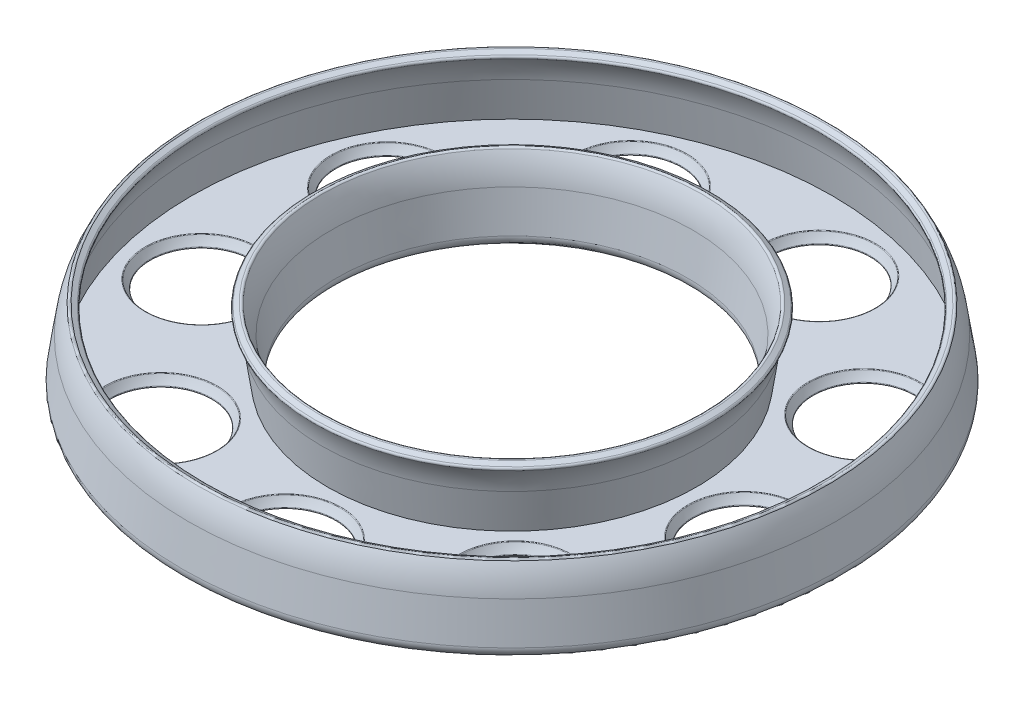
ISO-10303-21;
HEADER;
FILE_DESCRIPTION(('STEP AP214'),'2;1');
FILE_NAME('part.step','',(''),(''),'','','');
FILE_SCHEMA(('AUTOMOTIVE_DESIGN { 1 0 10303 214 1 1 1 1 }'));
ENDSEC;
DATA;
#1=APPLICATION_CONTEXT('core data for automotive mechanical design processes');
#2=APPLICATION_PROTOCOL_DEFINITION('international standard','automotive_design',2000,#1);
#3=PRODUCT_CONTEXT('',#1,'mechanical');
#4=PRODUCT('Part','Part','',(#3));
#5=PRODUCT_RELATED_PRODUCT_CATEGORY('part','',(#4));
#6=PRODUCT_DEFINITION_FORMATION('','',#4);
#7=PRODUCT_DEFINITION_CONTEXT('part definition',#1,'design');
#8=PRODUCT_DEFINITION('design','',#6,#7);
#9=PRODUCT_DEFINITION_SHAPE('','',#8);
#10=(LENGTH_UNIT() NAMED_UNIT(*) SI_UNIT(.MILLI.,.METRE.));
#11=(NAMED_UNIT(*) PLANE_ANGLE_UNIT() SI_UNIT($,.RADIAN.));
#12=(NAMED_UNIT(*) SI_UNIT($,.STERADIAN.) SOLID_ANGLE_UNIT());
#13=UNCERTAINTY_MEASURE_WITH_UNIT(LENGTH_MEASURE(1.E-05),#10,'distance_accuracy_value','');
#14=(GEOMETRIC_REPRESENTATION_CONTEXT(3) GLOBAL_UNCERTAINTY_ASSIGNED_CONTEXT((#13)) GLOBAL_UNIT_ASSIGNED_CONTEXT((#10,
#11,#12)) REPRESENTATION_CONTEXT('',''));
#15=CARTESIAN_POINT('',(0.,0.,0.));
#16=DIRECTION('',(0.,0.,1.));
#17=DIRECTION('',(1.,0.,0.));
#18=AXIS2_PLACEMENT_3D('',#15,#16,#17);
#19=CARTESIAN_POINT('',(0.,0.,0.));
#20=DIRECTION('',(0.,1.,0.));
#21=DIRECTION('',(1.,0.,0.));
#22=AXIS2_PLACEMENT_3D('',#19,#20,#21);
#23=PLANE('',#22);
#24=CARTESIAN_POINT('',(0.,0.,0.));
#25=DIRECTION('',(0.,1.,0.));
#26=DIRECTION('',(0.,0.,1.));
#27=AXIS2_PLACEMENT_3D('',#24,#25,#26);
#28=CIRCLE('',#27,4.40000000001);
#29=CARTESIAN_POINT('',(0.,0.,4.40000000001));
#30=VERTEX_POINT('',#29);
#31=EDGE_CURVE('E321',#30,#30,#28,.T.);
#32=ORIENTED_EDGE('',*,*,#31,.T.);
#33=EDGE_LOOP('',(#32));
#34=FACE_BOUND('',#33,.T.);
#35=CARTESIAN_POINT('',(-2.59448516011472,1.00000982558219E-11,-5.43222300298));
#36=DIRECTION('',(0.,1.,0.));
#37=DIRECTION('',(0.,0.,1.));
#38=AXIS2_PLACEMENT_3D('',#35,#36,#37);
#39=CIRCLE('',#38,1.22856623754056);
#40=CARTESIAN_POINT('',(-2.59448516011472,1.00000982558219E-11,-4.20365676543944));
#41=VERTEX_POINT('',#40);
#42=EDGE_CURVE('E251',#41,#41,#39,.T.);
#43=ORIENTED_EDGE('',*,*,#42,.T.);
#44=EDGE_LOOP('',(#43));
#45=FACE_BOUND('',#44,.T.);
#46=CARTESIAN_POINT('',(1.50427469972045,1.00000982558219E-11,-5.82902715964917));
#47=DIRECTION('',(0.,1.,0.));
#48=DIRECTION('',(0.,0.,1.));
#49=AXIS2_PLACEMENT_3D('',#46,#47,#48);
#50=CIRCLE('',#49,1.22856623754056);
#51=CARTESIAN_POINT('',(1.50427469972045,1.00000982558219E-11,-4.60046092210861));
#52=VERTEX_POINT('',#51);
#53=EDGE_CURVE('E261',#52,#52,#50,.T.);
#54=ORIENTED_EDGE('',*,*,#53,.T.);
#55=EDGE_LOOP('',(#54));
#56=FACE_BOUND('',#55,.T.);
#57=CARTESIAN_POINT('',(4.89916770939004,1.00000982558219E-11,-3.49836472590236));
#58=DIRECTION('',(0.,1.,0.));
#59=DIRECTION('',(0.,0.,1.));
#60=AXIS2_PLACEMENT_3D('',#57,#58,#59);
#61=CIRCLE('',#60,1.22856623754056);
#62=CARTESIAN_POINT('',(4.89916770939004,1.00000982558219E-11,-2.2697984883618));
#63=VERTEX_POINT('',#62);
#64=EDGE_CURVE('E269',#63,#63,#61,.T.);
#65=ORIENTED_EDGE('',*,*,#64,.T.);
#66=EDGE_LOOP('',(#65));
#67=FACE_BOUND('',#66,.T.);
#68=CARTESIAN_POINT('',(-5.4792565790262,1.00000982558219E-11,-2.49362133078733));
#69=DIRECTION('',(0.,1.,0.));
#70=DIRECTION('',(0.,0.,1.));
#71=AXIS2_PLACEMENT_3D('',#68,#69,#70);
#72=CIRCLE('',#71,1.22856623754056);
#73=CARTESIAN_POINT('',(-5.4792565790262,1.00000982558219E-11,-1.26505509324677));
#74=VERTEX_POINT('',#73);
#75=EDGE_CURVE('E280',#74,#74,#72,.T.);
#76=ORIENTED_EDGE('',*,*,#75,.T.);
#77=EDGE_LOOP('',(#76));
#78=FACE_BOUND('',#77,.T.);
#79=CARTESIAN_POINT('',(-5.80022294946221,1.00000982558219E-11,1.61177347561007));
#80=DIRECTION('',(0.,1.,0.));
#81=DIRECTION('',(0.,0.,1.));
#82=AXIS2_PLACEMENT_3D('',#79,#80,#81);
#83=CIRCLE('',#82,1.22856623754056);
#84=CARTESIAN_POINT('',(-5.80022294946221,1.00000982558219E-11,2.84033971315063));
#85=VERTEX_POINT('',#84);
#86=EDGE_CURVE('E285',#85,#85,#83,.T.);
#87=ORIENTED_EDGE('',*,*,#86,.T.);
#88=EDGE_LOOP('',(#87));
#89=FACE_BOUND('',#88,.T.);
#90=CARTESIAN_POINT('',(-3.40720053955189,1.00000982558219E-11,4.96300155988739));
#91=DIRECTION('',(0.,1.,0.));
#92=DIRECTION('',(0.,0.,1.));
#93=AXIS2_PLACEMENT_3D('',#90,#91,#92);
#94=CIRCLE('',#93,1.22856623754056);
#95=CARTESIAN_POINT('',(-3.40720053955189,1.00000982558219E-11,6.19156779742795));
#96=VERTEX_POINT('',#95);
#97=EDGE_CURVE('E284',#96,#96,#94,.T.);
#98=ORIENTED_EDGE('',*,*,#97,.T.);
#99=EDGE_LOOP('',(#98));
#100=FACE_BOUND('',#99,.T.);
#101=CARTESIAN_POINT('',(0.580088869646118,1.00000982558219E-11,5.99198605667972));
#102=DIRECTION('',(0.,1.,0.));
#103=DIRECTION('',(0.,0.,1.));
#104=AXIS2_PLACEMENT_3D('',#101,#102,#103);
#105=CIRCLE('',#104,1.22856623754056);
#106=CARTESIAN_POINT('',(0.580088869646118,1.00000982558219E-11,7.22055229422028));
#107=VERTEX_POINT('',#106);
#108=EDGE_CURVE('E264',#107,#107,#105,.T.);
#109=ORIENTED_EDGE('',*,*,#108,.T.);
#110=EDGE_LOOP('',(#109));
#111=FACE_BOUND('',#110,.T.);
#112=CARTESIAN_POINT('',(4.29594824975172,1.00000982558219E-11,4.21725368404906));
#113=DIRECTION('',(0.,1.,0.));
#114=DIRECTION('',(0.,0.,1.));
#115=AXIS2_PLACEMENT_3D('',#112,#113,#114);
#116=CIRCLE('',#115,1.22856623754056);
#117=CARTESIAN_POINT('',(4.29594824975172,1.00000982558219E-11,5.44581992158962));
#118=VERTEX_POINT('',#117);
#119=EDGE_CURVE('E298',#118,#118,#116,.T.);
#120=ORIENTED_EDGE('',*,*,#119,.T.);
#121=EDGE_LOOP('',(#120));
#122=FACE_BOUND('',#121,.T.);
#123=CARTESIAN_POINT('',(6.00168569965657,1.00000982558219E-11,0.469221443102596));
#124=DIRECTION('',(0.,1.,0.));
#125=DIRECTION('',(0.,0.,1.));
#126=AXIS2_PLACEMENT_3D('',#123,#124,#125);
#127=CIRCLE('',#126,1.22856623754056);
#128=CARTESIAN_POINT('',(6.00168569965657,1.00000982558219E-11,1.69778768064315));
#129=VERTEX_POINT('',#128);
#130=EDGE_CURVE('E306',#129,#129,#127,.T.);
#131=ORIENTED_EDGE('',*,*,#130,.T.);
#132=EDGE_LOOP('',(#131));
#133=FACE_BOUND('',#132,.T.);
#134=CARTESIAN_POINT('',(0.,1.00001996174283E-11,0.));
#135=DIRECTION('',(0.,1.,0.));
#136=DIRECTION('',(0.,0.,1.));
#137=AXIS2_PLACEMENT_3D('',#134,#135,#136);
#138=CIRCLE('',#137,7.64000000001);
#139=CARTESIAN_POINT('',(0.,1.00001996174283E-11,7.64000000001));
#140=VERTEX_POINT('',#139);
#141=EDGE_CURVE('E348',#140,#140,#138,.T.);
#142=ORIENTED_EDGE('',*,*,#141,.F.);
#143=EDGE_LOOP('',(#142));
#144=FACE_BOUND('',#143,.T.);
#145=ADVANCED_FACE('F17',(#34,#45,#56,#67,#78,#89,#100,#111,#122,#133,#144),#23,.F.);
#146=CARTESIAN_POINT('',(0.,0.22,0.));
#147=DIRECTION('',(0.,1.,0.));
#148=DIRECTION('',(1.,0.,0.));
#149=AXIS2_PLACEMENT_3D('',#146,#147,#148);
#150=PLANE('',#149);
#151=CARTESIAN_POINT('',(0.,0.22000000001,0.));
#152=DIRECTION('',(0.,1.,0.));
#153=DIRECTION('',(0.,0.,1.));
#154=AXIS2_PLACEMENT_3D('',#151,#152,#153);
#155=CIRCLE('',#154,4.40000000001);
#156=CARTESIAN_POINT('',(0.,0.22000000001,4.40000000001));
#157=VERTEX_POINT('',#156);
#158=EDGE_CURVE('E358',#157,#157,#155,.T.);
#159=ORIENTED_EDGE('',*,*,#158,.F.);
#160=EDGE_LOOP('',(#159));
#161=FACE_BOUND('',#160,.T.);
#162=CARTESIAN_POINT('',(-2.59448516011472,0.22000000001,-5.43222300298));
#163=DIRECTION('',(0.,-1.,0.));
#164=DIRECTION('',(0.,0.,1.));
#165=AXIS2_PLACEMENT_3D('',#162,#163,#164);
#166=CIRCLE('',#165,1.34133329192517);
#167=CARTESIAN_POINT('',(-2.59448516011472,0.22000000001,-4.09088971105483));
#168=VERTEX_POINT('',#167);
#169=EDGE_CURVE('E336',#168,#168,#166,.T.);
#170=ORIENTED_EDGE('',*,*,#169,.T.);
#171=EDGE_LOOP('',(#170));
#172=FACE_BOUND('',#171,.T.);
#173=CARTESIAN_POINT('',(1.50427469972045,0.22000000001,-5.82902715964917));
#174=DIRECTION('',(0.,-1.,0.));
#175=DIRECTION('',(0.,0.,1.));
#176=AXIS2_PLACEMENT_3D('',#173,#174,#175);
#177=CIRCLE('',#176,1.34133329192517);
#178=CARTESIAN_POINT('',(1.50427469972045,0.22000000001,-4.487693867724));
#179=VERTEX_POINT('',#178);
#180=EDGE_CURVE('E342',#179,#179,#177,.T.);
#181=ORIENTED_EDGE('',*,*,#180,.T.);
#182=EDGE_LOOP('',(#181));
#183=FACE_BOUND('',#182,.T.);
#184=CARTESIAN_POINT('',(4.89916770939004,0.22000000001,-3.49836472590236));
#185=DIRECTION('',(0.,-1.,0.));
#186=DIRECTION('',(0.,0.,1.));
#187=AXIS2_PLACEMENT_3D('',#184,#185,#186);
#188=CIRCLE('',#187,1.34133329192517);
#189=CARTESIAN_POINT('',(4.89916770939004,0.22000000001,-2.15703143397719));
#190=VERTEX_POINT('',#189);
#191=EDGE_CURVE('E351',#190,#190,#188,.T.);
#192=ORIENTED_EDGE('',*,*,#191,.T.);
#193=EDGE_LOOP('',(#192));
#194=FACE_BOUND('',#193,.T.);
#195=CARTESIAN_POINT('',(-5.4792565790262,0.22000000001,-2.49362133078733));
#196=DIRECTION('',(0.,-1.,0.));
#197=DIRECTION('',(0.,0.,1.));
#198=AXIS2_PLACEMENT_3D('',#195,#196,#197);
#199=CIRCLE('',#198,1.34133329192517);
#200=CARTESIAN_POINT('',(-5.4792565790262,0.22000000001,-1.15228803886216));
#201=VERTEX_POINT('',#200);
#202=EDGE_CURVE('E362',#201,#201,#199,.T.);
#203=ORIENTED_EDGE('',*,*,#202,.T.);
#204=EDGE_LOOP('',(#203));
#205=FACE_BOUND('',#204,.T.);
#206=CARTESIAN_POINT('',(-5.80022294946221,0.22000000001,1.61177347561007));
#207=DIRECTION('',(0.,-1.,0.));
#208=DIRECTION('',(0.,0.,1.));
#209=AXIS2_PLACEMENT_3D('',#206,#207,#208);
#210=CIRCLE('',#209,1.34133329192517);
#211=CARTESIAN_POINT('',(-5.80022294946221,0.22000000001,2.95310676753524));
#212=VERTEX_POINT('',#211);
#213=EDGE_CURVE('E295',#212,#212,#210,.T.);
#214=ORIENTED_EDGE('',*,*,#213,.T.);
#215=EDGE_LOOP('',(#214));
#216=FACE_BOUND('',#215,.T.);
#217=CARTESIAN_POINT('',(-3.40720053955189,0.22000000001,4.96300155988739));
#218=DIRECTION('',(0.,-1.,0.));
#219=DIRECTION('',(0.,0.,1.));
#220=AXIS2_PLACEMENT_3D('',#217,#218,#219);
#221=CIRCLE('',#220,1.34133329192517);
#222=CARTESIAN_POINT('',(-3.40720053955189,0.22000000001,6.30433485181256));
#223=VERTEX_POINT('',#222);
#224=EDGE_CURVE('E294',#223,#223,#221,.T.);
#225=ORIENTED_EDGE('',*,*,#224,.T.);
#226=EDGE_LOOP('',(#225));
#227=FACE_BOUND('',#226,.T.);
#228=CARTESIAN_POINT('',(0.580088869646118,0.22000000001,5.99198605667972));
#229=DIRECTION('',(0.,-1.,0.));
#230=DIRECTION('',(0.,0.,1.));
#231=AXIS2_PLACEMENT_3D('',#228,#229,#230);
#232=CIRCLE('',#231,1.34133329192517);
#233=CARTESIAN_POINT('',(0.580088869646118,0.22000000001,7.33331934860489));
#234=VERTEX_POINT('',#233);
#235=EDGE_CURVE('E383',#234,#234,#232,.T.);
#236=ORIENTED_EDGE('',*,*,#235,.T.);
#237=EDGE_LOOP('',(#236));
#238=FACE_BOUND('',#237,.T.);
#239=CARTESIAN_POINT('',(4.29594824975172,0.22000000001,4.21725368404906));
#240=DIRECTION('',(0.,-1.,0.));
#241=DIRECTION('',(0.,0.,1.));
#242=AXIS2_PLACEMENT_3D('',#239,#240,#241);
#243=CIRCLE('',#242,1.34133329192517);
#244=CARTESIAN_POINT('',(4.29594824975172,0.22000000001,5.55858697597423));
#245=VERTEX_POINT('',#244);
#246=EDGE_CURVE('E377',#245,#245,#243,.T.);
#247=ORIENTED_EDGE('',*,*,#246,.T.);
#248=EDGE_LOOP('',(#247));
#249=FACE_BOUND('',#248,.T.);
#250=CARTESIAN_POINT('',(6.00168569965657,0.22000000001,0.469221443102596));
#251=DIRECTION('',(0.,-1.,0.));
#252=DIRECTION('',(0.,0.,1.));
#253=AXIS2_PLACEMENT_3D('',#250,#251,#252);
#254=CIRCLE('',#253,1.34133329192517);
#255=CARTESIAN_POINT('',(6.00168569965657,0.22000000001,1.81055473502777));
#256=VERTEX_POINT('',#255);
#257=EDGE_CURVE('E314',#256,#256,#254,.T.);
#258=ORIENTED_EDGE('',*,*,#257,.T.);
#259=EDGE_LOOP('',(#258));
#260=FACE_BOUND('',#259,.T.);
#261=CARTESIAN_POINT('',(0.,0.22000000001,0.));
#262=DIRECTION('',(0.,1.,0.));
#263=DIRECTION('',(0.,0.,1.));
#264=AXIS2_PLACEMENT_3D('',#261,#262,#263);
#265=CIRCLE('',#264,7.64000000001);
#266=CARTESIAN_POINT('',(0.,0.22000000001,7.64000000001));
#267=VERTEX_POINT('',#266);
#268=EDGE_CURVE('E368',#267,#267,#265,.T.);
#269=ORIENTED_EDGE('',*,*,#268,.T.);
#270=EDGE_LOOP('',(#269));
#271=FACE_BOUND('',#270,.T.);
#272=ADVANCED_FACE('F19',(#161,#172,#183,#194,#205,#216,#227,#238,#249,#260,#271),#150,.T.);
#273=CARTESIAN_POINT('',(0.,1.16827390606098,0.));
#274=DIRECTION('',(0.,-1.,0.));
#275=DIRECTION('',(0.,0.,-1.));
#276=AXIS2_PLACEMENT_3D('',#273,#274,#275);
#277=CONICAL_SURFACE('',#276,7.7212502251311,0.14778968226717);
#278=CARTESIAN_POINT('',(0.,1.16827390607098,0.));
#279=DIRECTION('',(0.,1.,0.));
#280=DIRECTION('',(0.,0.,1.));
#281=AXIS2_PLACEMENT_3D('',#278,#279,#280);
#282=CIRCLE('',#281,7.7212502251411);
#283=CARTESIAN_POINT('',(0.,1.16827390607098,7.7212502251411));
#284=VERTEX_POINT('',#283);
#285=EDGE_CURVE('E11',#284,#284,#282,.T.);
#286=ORIENTED_EDGE('',*,*,#285,.F.);
#287=EDGE_LOOP('',(#286));
#288=FACE_BOUND('',#287,.T.);
#289=CARTESIAN_POINT('',(0.,0.252395499622451,0.));
#290=DIRECTION('',(0.,1.,0.));
#291=DIRECTION('',(0.,0.,1.));
#292=AXIS2_PLACEMENT_3D('',#289,#290,#291);
#293=CIRCLE('',#292,7.85760177299188);
#294=CARTESIAN_POINT('',(0.,0.252395499622451,7.85760177299188));
#295=VERTEX_POINT('',#294);
#296=EDGE_CURVE('E317',#295,#295,#293,.T.);
#297=ORIENTED_EDGE('',*,*,#296,.T.);
#298=EDGE_LOOP('',(#297));
#299=FACE_BOUND('',#298,.T.);
#300=ADVANCED_FACE('F1065',(#288,#299),#277,.T.);
#301=CARTESIAN_POINT('',(0.,0.891058031943213,0.));
#302=DIRECTION('',(0.,1.,0.));
#303=DIRECTION('',(0.,0.,1.));
#304=AXIS2_PLACEMENT_3D('',#301,#302,#303);
#305=TOROIDAL_SURFACE('',#304,5.85918091215886,1.88259150300212);
#306=ORIENTED_EDGE('',*,*,#285,.T.);
#307=EDGE_LOOP('',(#306));
#308=FACE_BOUND('',#307,.T.);
#309=CARTESIAN_POINT('',(0.,1.80425368574958,0.));
#310=DIRECTION('',(0.,1.,0.));
#311=DIRECTION('',(0.,0.,1.));
#312=AXIS2_PLACEMENT_3D('',#309,#310,#311);
#313=CIRCLE('',#312,7.5054568504803);
#314=CARTESIAN_POINT('',(0.,1.80425368574958,7.5054568504803));
#315=VERTEX_POINT('',#314);
#316=EDGE_CURVE('E26',#315,#315,#313,.T.);
#317=ORIENTED_EDGE('',*,*,#316,.F.);
#318=EDGE_LOOP('',(#317));
#319=FACE_BOUND('',#318,.T.);
#320=ADVANCED_FACE('F1057',(#308,#319),#305,.T.);
#321=CARTESIAN_POINT('',(0.,1.78,0.));
#322=DIRECTION('',(0.,1.,0.));
#323=DIRECTION('',(0.,0.,1.));
#324=AXIS2_PLACEMENT_3D('',#321,#322,#323);
#325=TOROIDAL_SURFACE('',#324,7.46173318721977,0.05);
#326=ORIENTED_EDGE('',*,*,#316,.T.);
#327=EDGE_LOOP('',(#326));
#328=FACE_BOUND('',#327,.T.);
#329=CARTESIAN_POINT('',(0.,1.82389005707395,0.));
#330=DIRECTION('',(0.,1.,0.));
#331=DIRECTION('',(0.,0.,1.));
#332=AXIS2_PLACEMENT_3D('',#329,#330,#331);
#333=CIRCLE('',#332,7.4377819264921);
#334=CARTESIAN_POINT('',(0.,1.82389005707395,7.4377819264921));
#335=VERTEX_POINT('',#334);
#336=EDGE_CURVE('E404',#335,#335,#333,.T.);
#337=ORIENTED_EDGE('',*,*,#336,.F.);
#338=EDGE_LOOP('',(#337));
#339=FACE_BOUND('',#338,.T.);
#340=ADVANCED_FACE('F1048',(#328,#339),#325,.T.);
#341=CARTESIAN_POINT('',(0.,1.82389005706395,0.));
#342=DIRECTION('',(0.,1.,0.));
#343=DIRECTION('',(0.,0.,1.));
#344=AXIS2_PLACEMENT_3D('',#341,#342,#343);
#345=CONICAL_SURFACE('',#344,7.4377819264821,1.07125243658243);
#346=CARTESIAN_POINT('',(0.,1.76640636340197,0.));
#347=DIRECTION('',(0.,1.,0.));
#348=DIRECTION('',(0.,0.,1.));
#349=AXIS2_PLACEMENT_3D('',#346,#347,#348);
#350=CIRCLE('',#349,7.33244456562651);
#351=CARTESIAN_POINT('',(0.,1.76640636340197,7.33244456562651));
#352=VERTEX_POINT('',#351);
#353=EDGE_CURVE('E330',#352,#352,#350,.T.);
#354=ORIENTED_EDGE('',*,*,#353,.F.);
#355=EDGE_LOOP('',(#354));
#356=FACE_BOUND('',#355,.T.);
#357=ORIENTED_EDGE('',*,*,#336,.T.);
#358=EDGE_LOOP('',(#357));
#359=FACE_BOUND('',#358,.T.);
#360=ADVANCED_FACE('F731',(#356,#359),#345,.F.);
#361=CARTESIAN_POINT('',(0.,0.891054187571443,0.));
#362=DIRECTION('',(0.,1.,0.));
#363=DIRECTION('',(0.,0.,1.));
#364=AXIS2_PLACEMENT_3D('',#361,#362,#363);
#365=TOROIDAL_SURFACE('',#364,5.85915508937103,1.6626176103874);
#366=CARTESIAN_POINT('',(0.,1.13587840645853,0.));
#367=DIRECTION('',(0.,1.,0.));
#368=DIRECTION('',(0.,0.,1.));
#369=AXIS2_PLACEMENT_3D('',#366,#367,#368);
#370=CIRCLE('',#369,7.50364845215922);
#371=CARTESIAN_POINT('',(0.,1.13587840645853,7.50364845215922));
#372=VERTEX_POINT('',#371);
#373=EDGE_CURVE('E371',#372,#372,#370,.T.);
#374=ORIENTED_EDGE('',*,*,#373,.F.);
#375=EDGE_LOOP('',(#374));
#376=FACE_BOUND('',#375,.T.);
#377=CARTESIAN_POINT('',(0.,1.69824170721813,0.));
#378=DIRECTION('',(0.,1.,0.));
#379=DIRECTION('',(0.,0.,1.));
#380=AXIS2_PLACEMENT_3D('',#377,#378,#379);
#381=CIRCLE('',#380,7.3126837703891);
#382=CARTESIAN_POINT('',(0.,1.69824170721813,7.3126837703891));
#383=VERTEX_POINT('',#382);
#384=EDGE_CURVE('E327',#383,#383,#381,.T.);
#385=ORIENTED_EDGE('',*,*,#384,.T.);
#386=EDGE_LOOP('',(#385));
#387=FACE_BOUND('',#386,.T.);
#388=ADVANCED_FACE('F726',(#376,#387),#365,.F.);
#389=CARTESIAN_POINT('',(0.,0.22,0.));
#390=DIRECTION('',(0.,-1.,0.));
#391=DIRECTION('',(0.,0.,-1.));
#392=AXIS2_PLACEMENT_3D('',#389,#390,#391);
#393=CONICAL_SURFACE('',#392,7.64,0.147789682267168);
#394=ORIENTED_EDGE('',*,*,#373,.T.);
#395=EDGE_LOOP('',(#394));
#396=FACE_BOUND('',#395,.T.);
#397=ORIENTED_EDGE('',*,*,#268,.F.);
#398=EDGE_LOOP('',(#397));
#399=FACE_BOUND('',#398,.T.);
#400=ADVANCED_FACE('F730',(#396,#399),#393,.F.);
#401=CARTESIAN_POINT('',(0.,0.22,0.));
#402=DIRECTION('',(0.,1.,0.));
#403=DIRECTION('',(0.,0.,1.));
#404=AXIS2_PLACEMENT_3D('',#401,#402,#403);
#405=CONICAL_SURFACE('',#404,4.4,0.14778968226717);
#406=ORIENTED_EDGE('',*,*,#158,.T.);
#407=EDGE_LOOP('',(#406));
#408=FACE_BOUND('',#407,.T.);
#409=CARTESIAN_POINT('',(0.,1.13587840645853,0.));
#410=DIRECTION('',(0.,1.,0.));
#411=DIRECTION('',(0.,0.,1.));
#412=AXIS2_PLACEMENT_3D('',#409,#410,#411);
#413=CIRCLE('',#412,4.53635154786079);
#414=CARTESIAN_POINT('',(0.,1.13587840645853,4.53635154786079));
#415=VERTEX_POINT('',#414);
#416=EDGE_CURVE('E355',#415,#415,#413,.T.);
#417=ORIENTED_EDGE('',*,*,#416,.F.);
#418=EDGE_LOOP('',(#417));
#419=FACE_BOUND('',#418,.T.);
#420=ADVANCED_FACE('F947',(#408,#419),#405,.T.);
#421=CARTESIAN_POINT('',(0.,0.891054187571443,0.));
#422=DIRECTION('',(0.,1.,0.));
#423=DIRECTION('',(0.,0.,1.));
#424=AXIS2_PLACEMENT_3D('',#421,#422,#423);
#425=TOROIDAL_SURFACE('',#424,6.18084491062897,1.6626176103874);
#426=CARTESIAN_POINT('',(0.,1.69824170721813,0.));
#427=DIRECTION('',(0.,1.,0.));
#428=DIRECTION('',(0.,0.,1.));
#429=AXIS2_PLACEMENT_3D('',#426,#427,#428);
#430=CIRCLE('',#429,4.7273162296309);
#431=CARTESIAN_POINT('',(0.,1.69824170721813,4.7273162296309));
#432=VERTEX_POINT('',#431);
#433=EDGE_CURVE('E359',#432,#432,#430,.T.);
#434=ORIENTED_EDGE('',*,*,#433,.F.);
#435=EDGE_LOOP('',(#434));
#436=FACE_BOUND('',#435,.T.);
#437=ORIENTED_EDGE('',*,*,#416,.T.);
#438=EDGE_LOOP('',(#437));
#439=FACE_BOUND('',#438,.T.);
#440=ADVANCED_FACE('F943',(#436,#439),#425,.F.);
#441=CARTESIAN_POINT('',(0.,1.72251630632802,0.));
#442=DIRECTION('',(0.,1.,0.));
#443=DIRECTION('',(0.,0.,1.));
#444=AXIS2_PLACEMENT_3D('',#441,#442,#443);
#445=TOROIDAL_SURFACE('',#444,4.68360417364583,0.05);
#446=ORIENTED_EDGE('',*,*,#433,.T.);
#447=EDGE_LOOP('',(#446));
#448=FACE_BOUND('',#447,.T.);
#449=CARTESIAN_POINT('',(0.,1.76640636340197,0.));
#450=DIRECTION('',(0.,1.,0.));
#451=DIRECTION('',(0.,0.,1.));
#452=AXIS2_PLACEMENT_3D('',#449,#450,#451);
#453=CIRCLE('',#452,4.70755543439349);
#454=CARTESIAN_POINT('',(0.,1.76640636340197,4.70755543439349));
#455=VERTEX_POINT('',#454);
#456=EDGE_CURVE('E386',#455,#455,#453,.T.);
#457=ORIENTED_EDGE('',*,*,#456,.F.);
#458=EDGE_LOOP('',(#457));
#459=FACE_BOUND('',#458,.T.);
#460=ADVANCED_FACE('F823',(#448,#459),#445,.T.);
#461=CARTESIAN_POINT('',(0.,1.82389005706395,0.));
#462=DIRECTION('',(0.,-1.,0.));
#463=DIRECTION('',(0.,0.,-1.));
#464=AXIS2_PLACEMENT_3D('',#461,#462,#463);
#465=CONICAL_SURFACE('',#464,4.6022180735179,1.07125243658244);
#466=CARTESIAN_POINT('',(0.,1.82389005707395,0.));
#467=DIRECTION('',(0.,1.,0.));
#468=DIRECTION('',(0.,0.,1.));
#469=AXIS2_PLACEMENT_3D('',#466,#467,#468);
#470=CIRCLE('',#469,4.6022180735279);
#471=CARTESIAN_POINT('',(0.,1.82389005707395,4.6022180735279));
#472=VERTEX_POINT('',#471);
#473=EDGE_CURVE('E401',#472,#472,#470,.T.);
#474=ORIENTED_EDGE('',*,*,#473,.F.);
#475=EDGE_LOOP('',(#474));
#476=FACE_BOUND('',#475,.T.);
#477=ORIENTED_EDGE('',*,*,#456,.T.);
#478=EDGE_LOOP('',(#477));
#479=FACE_BOUND('',#478,.T.);
#480=ADVANCED_FACE('F818',(#476,#479),#465,.T.);
#481=CARTESIAN_POINT('',(0.,1.78,0.));
#482=DIRECTION('',(0.,1.,0.));
#483=DIRECTION('',(0.,0.,1.));
#484=AXIS2_PLACEMENT_3D('',#481,#482,#483);
#485=TOROIDAL_SURFACE('',#484,4.57826681278023,0.05);
#486=ORIENTED_EDGE('',*,*,#473,.T.);
#487=EDGE_LOOP('',(#486));
#488=FACE_BOUND('',#487,.T.);
#489=CARTESIAN_POINT('',(0.,1.80425368574958,0.));
#490=DIRECTION('',(0.,1.,0.));
#491=DIRECTION('',(0.,0.,1.));
#492=AXIS2_PLACEMENT_3D('',#489,#490,#491);
#493=CIRCLE('',#492,4.53454314953971);
#494=CARTESIAN_POINT('',(0.,1.80425368574958,4.53454314953971));
#495=VERTEX_POINT('',#494);
#496=EDGE_CURVE('E398',#495,#495,#493,.T.);
#497=ORIENTED_EDGE('',*,*,#496,.F.);
#498=EDGE_LOOP('',(#497));
#499=FACE_BOUND('',#498,.T.);
#500=ADVANCED_FACE('F822',(#488,#499),#485,.T.);
#501=CARTESIAN_POINT('',(0.,0.891058031943213,0.));
#502=DIRECTION('',(0.,1.,0.));
#503=DIRECTION('',(0.,0.,1.));
#504=AXIS2_PLACEMENT_3D('',#501,#502,#503);
#505=TOROIDAL_SURFACE('',#504,6.18081908784115,1.88259150300212);
#506=ORIENTED_EDGE('',*,*,#496,.T.);
#507=EDGE_LOOP('',(#506));
#508=FACE_BOUND('',#507,.T.);
#509=CARTESIAN_POINT('',(0.,1.16827390607098,0.));
#510=DIRECTION('',(0.,1.,0.));
#511=DIRECTION('',(0.,0.,1.));
#512=AXIS2_PLACEMENT_3D('',#509,#510,#511);
#513=CIRCLE('',#512,4.3187497748789);
#514=CARTESIAN_POINT('',(0.,1.16827390607098,4.3187497748789));
#515=VERTEX_POINT('',#514);
#516=EDGE_CURVE('E395',#515,#515,#513,.T.);
#517=ORIENTED_EDGE('',*,*,#516,.F.);
#518=EDGE_LOOP('',(#517));
#519=FACE_BOUND('',#518,.T.);
#520=ADVANCED_FACE('F691',(#508,#519),#505,.T.);
#521=CARTESIAN_POINT('',(0.,1.16827390606098,0.));
#522=DIRECTION('',(0.,1.,0.));
#523=DIRECTION('',(0.,0.,1.));
#524=AXIS2_PLACEMENT_3D('',#521,#522,#523);
#525=CONICAL_SURFACE('',#524,4.3187497748689,0.14778968226717);
#526=CARTESIAN_POINT('',(0.,0.25239549962245,0.));
#527=DIRECTION('',(0.,1.,0.));
#528=DIRECTION('',(0.,0.,1.));
#529=AXIS2_PLACEMENT_3D('',#526,#527,#528);
#530=CIRCLE('',#529,4.18239822702812);
#531=CARTESIAN_POINT('',(0.,0.25239549962245,4.18239822702812));
#532=VERTEX_POINT('',#531);
#533=EDGE_CURVE('E324',#532,#532,#530,.T.);
#534=ORIENTED_EDGE('',*,*,#533,.F.);
#535=EDGE_LOOP('',(#534));
#536=FACE_BOUND('',#535,.T.);
#537=ORIENTED_EDGE('',*,*,#516,.T.);
#538=EDGE_LOOP('',(#537));
#539=FACE_BOUND('',#538,.T.);
#540=ADVANCED_FACE('F686',(#536,#539),#525,.F.);
#541=CARTESIAN_POINT('',(0.,0.22,0.));
#542=DIRECTION('',(0.,1.,0.));
#543=DIRECTION('',(0.,0.,1.));
#544=AXIS2_PLACEMENT_3D('',#541,#542,#543);
#545=TOROIDAL_SURFACE('',#544,7.64,0.22);
#546=ORIENTED_EDGE('',*,*,#141,.T.);
#547=EDGE_LOOP('',(#546));
#548=FACE_BOUND('',#547,.T.);
#549=ORIENTED_EDGE('',*,*,#296,.F.);
#550=EDGE_LOOP('',(#549));
#551=FACE_BOUND('',#550,.T.);
#552=ADVANCED_FACE('F690',(#548,#551),#545,.T.);
#553=CARTESIAN_POINT('',(-5.4792565790162,0.915,-2.49362133077733));
#554=DIRECTION('',(-0.00473871848795729,0.,0.999988772210514));
#555=DIRECTION('',(0.999988772210514,0.,0.00473871848795729));
#556=AXIS2_PLACEMENT_3D('',#553,#554,#555);
#557=SPHERICAL_SURFACE('',#556,1.5);
#558=CARTESIAN_POINT('',(-5.4792565790162,0.915,-2.49362133077733));
#559=DIRECTION('',(0.,1.,0.));
#560=DIRECTION('',(0.,0.,1.));
#561=AXIS2_PLACEMENT_3D('',#558,#559,#560);
#562=SPHERICAL_SURFACE('',#561,1.5);
#563=CARTESIAN_POINT('',(-5.4792565790262,0.209407894746843,-2.49362133078733));
#564=DIRECTION('',(0.,1.,0.));
#565=DIRECTION('',(0.,0.,1.));
#566=AXIS2_PLACEMENT_3D('',#563,#564,#565);
#567=CIRCLE('',#566,1.32368416966313);
#568=CARTESIAN_POINT('',(-5.4792565790262,0.209407894746843,-1.1699371611242));
#569=VERTEX_POINT('',#568);
#570=EDGE_CURVE('E354',#569,#569,#567,.T.);
#571=ORIENTED_EDGE('',*,*,#570,.T.);
#572=EDGE_LOOP('',(#571));
#573=FACE_BOUND('',#572,.T.);
#574=CARTESIAN_POINT('',(-5.4792565790262,0.0317763157994739,-2.49362133078733));
#575=DIRECTION('',(0.,-1.,0.));
#576=DIRECTION('',(0.,0.,1.));
#577=AXIS2_PLACEMENT_3D('',#574,#575,#576);
#578=CIRCLE('',#577,1.21240089230989);
#579=CARTESIAN_POINT('',(-5.4792565790262,0.0317763157994739,-1.28122043847744));
#580=VERTEX_POINT('',#579);
#581=EDGE_CURVE('E290',#580,#580,#578,.T.);
#582=ORIENTED_EDGE('',*,*,#581,.T.);
#583=EDGE_LOOP('',(#582));
#584=FACE_BOUND('',#583,.T.);
#585=ADVANCED_FACE('F983',(#573,#584),#562,.F.);
#586=CARTESIAN_POINT('',(6.00168569964657,0.915,0.469221443092596));
#587=DIRECTION('',(-0.337563364400379,0.,-0.941302807291414));
#588=DIRECTION('',(-0.941302807291414,0.,0.337563364400379));
#589=AXIS2_PLACEMENT_3D('',#586,#587,#588);
#590=SPHERICAL_SURFACE('',#589,1.5);
#591=CARTESIAN_POINT('',(6.00168569964657,0.915,0.469221443092596));
#592=DIRECTION('',(0.,1.,0.));
#593=DIRECTION('',(0.,0.,1.));
#594=AXIS2_PLACEMENT_3D('',#591,#592,#593);
#595=SPHERICAL_SURFACE('',#594,1.5);
#596=CARTESIAN_POINT('',(6.00168569965657,0.209407894746843,0.469221443102596));
#597=DIRECTION('',(0.,1.,0.));
#598=DIRECTION('',(0.,0.,1.));
#599=AXIS2_PLACEMENT_3D('',#596,#597,#598);
#600=CIRCLE('',#599,1.32368416966313);
#601=CARTESIAN_POINT('',(6.00168569965657,0.209407894746843,1.79290561276573));
#602=VERTEX_POINT('',#601);
#603=EDGE_CURVE('E318',#602,#602,#600,.T.);
#604=ORIENTED_EDGE('',*,*,#603,.T.);
#605=EDGE_LOOP('',(#604));
#606=FACE_BOUND('',#605,.T.);
#607=CARTESIAN_POINT('',(6.00168569965657,0.0317763157994739,0.469221443102596));
#608=DIRECTION('',(0.,-1.,0.));
#609=DIRECTION('',(-8.24881227420094E-12,0.,1.));
#610=AXIS2_PLACEMENT_3D('',#607,#608,#609);
#611=CIRCLE('',#610,1.21240089230989);
#612=CARTESIAN_POINT('',(6.00168569964657,0.0317763157994739,1.68162233541249));
#613=VERTEX_POINT('',#612);
#614=EDGE_CURVE('E313',#613,#613,#611,.T.);
#615=ORIENTED_EDGE('',*,*,#614,.T.);
#616=EDGE_LOOP('',(#615));
#617=FACE_BOUND('',#616,.T.);
#618=ADVANCED_FACE('F974',(#606,#617),#595,.F.);
#619=CARTESIAN_POINT('',(1.50427469971045,0.915,-5.82902715963917));
#620=DIRECTION('',(-0.985619565627984,0.,0.168979501275462));
#621=DIRECTION('',(0.168979501275462,0.,0.985619565627984));
#622=AXIS2_PLACEMENT_3D('',#619,#620,#621);
#623=SPHERICAL_SURFACE('',#622,1.5);
#624=CARTESIAN_POINT('',(1.50427469971045,0.915,-5.82902715963917));
#625=DIRECTION('',(0.,1.,0.));
#626=DIRECTION('',(0.,0.,1.));
#627=AXIS2_PLACEMENT_3D('',#624,#625,#626);
#628=SPHERICAL_SURFACE('',#627,1.5);
#629=CARTESIAN_POINT('',(1.50427469972045,0.209407894746842,-5.82902715964917));
#630=DIRECTION('',(0.,1.,0.));
#631=DIRECTION('',(0.,0.,1.));
#632=AXIS2_PLACEMENT_3D('',#629,#630,#631);
#633=CIRCLE('',#632,1.32368416966313);
#634=CARTESIAN_POINT('',(1.50427469972045,0.209407894746842,-4.50534298998604));
#635=VERTEX_POINT('',#634);
#636=EDGE_CURVE('E339',#635,#635,#633,.T.);
#637=ORIENTED_EDGE('',*,*,#636,.T.);
#638=EDGE_LOOP('',(#637));
#639=FACE_BOUND('',#638,.T.);
#640=CARTESIAN_POINT('',(1.50427469972045,0.0317763157994739,-5.82902715964917));
#641=DIRECTION('',(0.,-1.,0.));
#642=DIRECTION('',(8.24899112629175E-12,0.,1.));
#643=AXIS2_PLACEMENT_3D('',#640,#641,#642);
#644=CIRCLE('',#643,1.21240089230989);
#645=CARTESIAN_POINT('',(1.50427469973045,0.0317763157994739,-4.61662626733928));
#646=VERTEX_POINT('',#645);
#647=EDGE_CURVE('E272',#646,#646,#644,.T.);
#648=ORIENTED_EDGE('',*,*,#647,.T.);
#649=EDGE_LOOP('',(#648));
#650=FACE_BOUND('',#649,.T.);
#651=ADVANCED_FACE('F965',(#639,#650),#628,.F.);
#652=CARTESIAN_POINT('',(4.29594824974172,0.915,4.21725368403906));
#653=DIRECTION('',(0.346469241990622,0.,-0.938061332938547));
#654=DIRECTION('',(-0.938061332938547,0.,-0.346469241990622));
#655=AXIS2_PLACEMENT_3D('',#652,#653,#654);
#656=SPHERICAL_SURFACE('',#655,1.5);
#657=CARTESIAN_POINT('',(4.29594824974172,0.915,4.21725368403906));
#658=DIRECTION('',(0.,1.,0.));
#659=DIRECTION('',(0.,0.,1.));
#660=AXIS2_PLACEMENT_3D('',#657,#658,#659);
#661=SPHERICAL_SURFACE('',#660,1.5);
#662=CARTESIAN_POINT('',(4.29594824975172,0.209407894746842,4.21725368404906));
#663=DIRECTION('',(0.,1.,0.));
#664=DIRECTION('',(0.,0.,1.));
#665=AXIS2_PLACEMENT_3D('',#662,#663,#664);
#666=CIRCLE('',#665,1.32368416966313);
#667=CARTESIAN_POINT('',(4.29594824975172,0.209407894746842,5.54093785371219));
#668=VERTEX_POINT('',#667);
#669=EDGE_CURVE('E380',#668,#668,#666,.T.);
#670=ORIENTED_EDGE('',*,*,#669,.T.);
#671=EDGE_LOOP('',(#670));
#672=FACE_BOUND('',#671,.T.);
#673=CARTESIAN_POINT('',(4.29594824975172,0.0317763157994739,4.21725368404906));
#674=DIRECTION('',(0.,-1.,0.));
#675=DIRECTION('',(-8.24881227420094E-12,0.,1.));
#676=AXIS2_PLACEMENT_3D('',#673,#674,#675);
#677=CIRCLE('',#676,1.21240089230989);
#678=CARTESIAN_POINT('',(4.29594824974172,0.0317763157994739,5.42965457635895));
#679=VERTEX_POINT('',#678);
#680=EDGE_CURVE('E301',#679,#679,#677,.T.);
#681=ORIENTED_EDGE('',*,*,#680,.T.);
#682=EDGE_LOOP('',(#681));
#683=FACE_BOUND('',#682,.T.);
#684=ADVANCED_FACE('F956',(#672,#683),#661,.F.);
#685=CARTESIAN_POINT('',(-2.59448516010472,0.915,-5.43222300297));
#686=DIRECTION('',(-0.64641046156778,0.,0.762989852603381));
#687=DIRECTION('',(0.762989852603381,0.,0.64641046156778));
#688=AXIS2_PLACEMENT_3D('',#685,#686,#687);
#689=SPHERICAL_SURFACE('',#688,1.5);
#690=CARTESIAN_POINT('',(-2.59448516010472,0.915,-5.43222300297));
#691=DIRECTION('',(0.,1.,0.));
#692=DIRECTION('',(0.,0.,1.));
#693=AXIS2_PLACEMENT_3D('',#690,#691,#692);
#694=SPHERICAL_SURFACE('',#693,1.5);
#695=CARTESIAN_POINT('',(-2.59448516011472,0.209407894746842,-5.43222300298));
#696=DIRECTION('',(0.,1.,0.));
#697=DIRECTION('',(0.,0.,1.));
#698=AXIS2_PLACEMENT_3D('',#695,#696,#697);
#699=CIRCLE('',#698,1.32368416966313);
#700=CARTESIAN_POINT('',(-2.59448516011472,0.209407894746842,-4.10853883331687));
#701=VERTEX_POINT('',#700);
#702=EDGE_CURVE('E333',#701,#701,#699,.T.);
#703=ORIENTED_EDGE('',*,*,#702,.T.);
#704=EDGE_LOOP('',(#703));
#705=FACE_BOUND('',#704,.T.);
#706=CARTESIAN_POINT('',(-2.59448516011472,0.0317763157994739,-5.43222300298));
#707=DIRECTION('',(0.,-1.,0.));
#708=DIRECTION('',(8.24881227420094E-12,0.,1.));
#709=AXIS2_PLACEMENT_3D('',#706,#707,#708);
#710=CIRCLE('',#709,1.21240089230989);
#711=CARTESIAN_POINT('',(-2.59448516010472,0.0317763157994739,-4.21982211067011));
#712=VERTEX_POINT('',#711);
#713=EDGE_CURVE('E255',#712,#712,#710,.T.);
#714=ORIENTED_EDGE('',*,*,#713,.T.);
#715=EDGE_LOOP('',(#714));
#716=FACE_BOUND('',#715,.T.);
#717=ADVANCED_FACE('F937',(#705,#716),#694,.F.);
#718=CARTESIAN_POINT('',(4.89916770938004,0.915,-3.49836472589236));
#719=DIRECTION('',(-0.863646320989535,0.,-0.504098236697215));
#720=DIRECTION('',(-0.504098236697215,0.,0.863646320989535));
#721=AXIS2_PLACEMENT_3D('',#718,#719,#720);
#722=SPHERICAL_SURFACE('',#721,1.5);
#723=CARTESIAN_POINT('',(4.89916770938004,0.915,-3.49836472589236));
#724=DIRECTION('',(0.,1.,0.));
#725=DIRECTION('',(0.,0.,1.));
#726=AXIS2_PLACEMENT_3D('',#723,#724,#725);
#727=SPHERICAL_SURFACE('',#726,1.5);
#728=CARTESIAN_POINT('',(4.89916770939004,0.209407894746842,-3.49836472590236));
#729=DIRECTION('',(0.,1.,0.));
#730=DIRECTION('',(0.,0.,1.));
#731=AXIS2_PLACEMENT_3D('',#728,#729,#730);
#732=CIRCLE('',#731,1.32368416966313);
#733=CARTESIAN_POINT('',(4.89916770939004,0.209407894746842,-2.17468055623923));
#734=VERTEX_POINT('',#733);
#735=EDGE_CURVE('E345',#734,#734,#732,.T.);
#736=ORIENTED_EDGE('',*,*,#735,.T.);
#737=EDGE_LOOP('',(#736));
#738=FACE_BOUND('',#737,.T.);
#739=CARTESIAN_POINT('',(4.89916770939004,0.0317763157994739,-3.49836472590236));
#740=DIRECTION('',(0.,-1.,0.));
#741=DIRECTION('',(0.,0.,1.));
#742=AXIS2_PLACEMENT_3D('',#739,#740,#741);
#743=CIRCLE('',#742,1.21240089230989);
#744=CARTESIAN_POINT('',(4.89916770939004,0.0317763157994739,-2.28596383359247));
#745=VERTEX_POINT('',#744);
#746=EDGE_CURVE('E271',#745,#745,#743,.T.);
#747=ORIENTED_EDGE('',*,*,#746,.T.);
#748=EDGE_LOOP('',(#747));
#749=FACE_BOUND('',#748,.T.);
#750=ADVANCED_FACE('F878',(#738,#749),#727,.F.);
#751=CARTESIAN_POINT('',(0.580088869636118,0.915,5.99198605666972));
#752=DIRECTION('',(0.868385039477499,0.,-0.495890535513295));
#753=DIRECTION('',(-0.495890535513295,0.,-0.868385039477499));
#754=AXIS2_PLACEMENT_3D('',#751,#752,#753);
#755=SPHERICAL_SURFACE('',#754,1.5);
#756=CARTESIAN_POINT('',(0.580088869636118,0.915,5.99198605666972));
#757=DIRECTION('',(0.,1.,0.));
#758=DIRECTION('',(0.,0.,1.));
#759=AXIS2_PLACEMENT_3D('',#756,#757,#758);
#760=SPHERICAL_SURFACE('',#759,1.5);
#761=CARTESIAN_POINT('',(0.580088869646118,0.209407894746842,5.99198605667972));
#762=DIRECTION('',(0.,1.,0.));
#763=DIRECTION('',(0.,0.,1.));
#764=AXIS2_PLACEMENT_3D('',#761,#762,#763);
#765=CIRCLE('',#764,1.32368416966313);
#766=CARTESIAN_POINT('',(0.580088869646118,0.209407894746842,7.31567022634285));
#767=VERTEX_POINT('',#766);
#768=EDGE_CURVE('E376',#767,#767,#765,.T.);
#769=ORIENTED_EDGE('',*,*,#768,.T.);
#770=EDGE_LOOP('',(#769));
#771=FACE_BOUND('',#770,.T.);
#772=CARTESIAN_POINT('',(0.580088869646118,0.0317763157994739,5.99198605667972));
#773=DIRECTION('',(0.,-1.,0.));
#774=DIRECTION('',(8.251673907654E-12,0.,1.));
#775=AXIS2_PLACEMENT_3D('',#772,#773,#774);
#776=CIRCLE('',#775,1.21240089230989);
#777=CARTESIAN_POINT('',(0.580088869656122,0.0317763157994739,7.20438694898961));
#778=VERTEX_POINT('',#777);
#779=EDGE_CURVE('E267',#778,#778,#776,.T.);
#780=ORIENTED_EDGE('',*,*,#779,.T.);
#781=EDGE_LOOP('',(#780));
#782=FACE_BOUND('',#781,.T.);
#783=ADVANCED_FACE('F873',(#771,#782),#760,.F.);
#784=CARTESIAN_POINT('',(-3.40720053954189,0.915,4.96300155987739));
#785=DIRECTION('',(0.983973825968161,0.,0.17831295468804));
#786=DIRECTION('',(0.17831295468804,0.,-0.983973825968161));
#787=AXIS2_PLACEMENT_3D('',#784,#785,#786);
#788=SPHERICAL_SURFACE('',#787,1.5);
#789=CARTESIAN_POINT('',(-3.40720053954189,0.915,4.96300155987739));
#790=DIRECTION('',(0.,1.,0.));
#791=DIRECTION('',(0.,0.,1.));
#792=AXIS2_PLACEMENT_3D('',#789,#790,#791);
#793=SPHERICAL_SURFACE('',#792,1.5);
#794=CARTESIAN_POINT('',(-3.40720053955189,0.209407894746842,4.96300155988739));
#795=DIRECTION('',(0.,1.,0.));
#796=DIRECTION('',(0.,0.,1.));
#797=AXIS2_PLACEMENT_3D('',#794,#795,#796);
#798=CIRCLE('',#797,1.32368416966313);
#799=CARTESIAN_POINT('',(-3.40720053955189,0.209407894746842,6.28668572955052));
#800=VERTEX_POINT('',#799);
#801=EDGE_CURVE('E291',#800,#800,#798,.T.);
#802=ORIENTED_EDGE('',*,*,#801,.T.);
#803=EDGE_LOOP('',(#802));
#804=FACE_BOUND('',#803,.T.);
#805=CARTESIAN_POINT('',(-3.40720053955189,0.0317763157994739,4.96300155988739));
#806=DIRECTION('',(0.,-1.,0.));
#807=DIRECTION('',(0.,0.,1.));
#808=AXIS2_PLACEMENT_3D('',#805,#806,#807);
#809=CIRCLE('',#808,1.21240089230989);
#810=CARTESIAN_POINT('',(-3.40720053955189,0.0317763157994739,6.17540245219728));
#811=VERTEX_POINT('',#810);
#812=EDGE_CURVE('E268',#811,#811,#809,.T.);
#813=ORIENTED_EDGE('',*,*,#812,.T.);
#814=EDGE_LOOP('',(#813));
#815=FACE_BOUND('',#814,.T.);
#816=ADVANCED_FACE('F877',(#804,#815),#793,.F.);
#817=CARTESIAN_POINT('',(-5.80022294945221,0.915,1.61177347560007));
#818=DIRECTION('',(0.63915032363736,0.,0.769081831663093));
#819=DIRECTION('',(0.769081831663093,0.,-0.63915032363736));
#820=AXIS2_PLACEMENT_3D('',#817,#818,#819);
#821=SPHERICAL_SURFACE('',#820,1.5);
#822=CARTESIAN_POINT('',(-5.80022294945221,0.915,1.61177347560007));
#823=DIRECTION('',(0.,1.,0.));
#824=DIRECTION('',(0.,0.,1.));
#825=AXIS2_PLACEMENT_3D('',#822,#823,#824);
#826=SPHERICAL_SURFACE('',#825,1.5);
#827=CARTESIAN_POINT('',(-5.80022294946221,0.209407894746842,1.61177347561007));
#828=DIRECTION('',(0.,1.,0.));
#829=DIRECTION('',(0.,0.,1.));
#830=AXIS2_PLACEMENT_3D('',#827,#828,#829);
#831=CIRCLE('',#830,1.32368416966313);
#832=CARTESIAN_POINT('',(-5.80022294946221,0.209407894746842,2.9354576452732));
#833=VERTEX_POINT('',#832);
#834=EDGE_CURVE('E365',#833,#833,#831,.T.);
#835=ORIENTED_EDGE('',*,*,#834,.T.);
#836=EDGE_LOOP('',(#835));
#837=FACE_BOUND('',#836,.T.);
#838=CARTESIAN_POINT('',(-5.80022294946221,0.0317763157994739,1.61177347561007));
#839=DIRECTION('',(0.,-1.,0.));
#840=DIRECTION('',(-8.2495276825642E-12,0.,1.));
#841=AXIS2_PLACEMENT_3D('',#838,#839,#840);
#842=CIRCLE('',#841,1.21240089230989);
#843=CARTESIAN_POINT('',(-5.80022294947221,0.0317763157994739,2.82417436791996));
#844=VERTEX_POINT('',#843);
#845=EDGE_CURVE('E281',#844,#844,#842,.T.);
#846=ORIENTED_EDGE('',*,*,#845,.T.);
#847=EDGE_LOOP('',(#846));
#848=FACE_BOUND('',#847,.T.);
#849=ADVANCED_FACE('F834',(#837,#848),#826,.F.);
#850=CARTESIAN_POINT('',(6.00168569964657,0.2,0.469221443092596));
#851=DIRECTION('',(0.,1.,0.));
#852=DIRECTION('',(0.,0.,1.));
#853=AXIS2_PLACEMENT_3D('',#850,#851,#852);
#854=TOROIDAL_SURFACE('',#853,1.34133329191517,0.02);
#855=ORIENTED_EDGE('',*,*,#257,.F.);
#856=EDGE_LOOP('',(#855));
#857=FACE_BOUND('',#856,.T.);
#858=ORIENTED_EDGE('',*,*,#603,.F.);
#859=EDGE_LOOP('',(#858));
#860=FACE_BOUND('',#859,.T.);
#861=ADVANCED_FACE('F829',(#857,#860),#854,.T.);
#862=CARTESIAN_POINT('',(4.29594824974172,0.2,4.21725368403906));
#863=DIRECTION('',(0.,1.,0.));
#864=DIRECTION('',(0.,0.,1.));
#865=AXIS2_PLACEMENT_3D('',#862,#863,#864);
#866=TOROIDAL_SURFACE('',#865,1.34133329191517,0.02);
#867=ORIENTED_EDGE('',*,*,#246,.F.);
#868=EDGE_LOOP('',(#867));
#869=FACE_BOUND('',#868,.T.);
#870=ORIENTED_EDGE('',*,*,#669,.F.);
#871=EDGE_LOOP('',(#870));
#872=FACE_BOUND('',#871,.T.);
#873=ADVANCED_FACE('F833',(#869,#872),#866,.T.);
#874=CARTESIAN_POINT('',(0.580088869636118,0.2,5.99198605666972));
#875=DIRECTION('',(0.,1.,0.));
#876=DIRECTION('',(0.,0.,1.));
#877=AXIS2_PLACEMENT_3D('',#874,#875,#876);
#878=TOROIDAL_SURFACE('',#877,1.34133329191517,0.02);
#879=ORIENTED_EDGE('',*,*,#235,.F.);
#880=EDGE_LOOP('',(#879));
#881=FACE_BOUND('',#880,.T.);
#882=ORIENTED_EDGE('',*,*,#768,.F.);
#883=EDGE_LOOP('',(#882));
#884=FACE_BOUND('',#883,.T.);
#885=ADVANCED_FACE('F896',(#881,#884),#878,.T.);
#886=CARTESIAN_POINT('',(-3.40720053954189,0.2,4.96300155987739));
#887=DIRECTION('',(0.,1.,0.));
#888=DIRECTION('',(0.,0.,1.));
#889=AXIS2_PLACEMENT_3D('',#886,#887,#888);
#890=TOROIDAL_SURFACE('',#889,1.34133329191517,0.02);
#891=ORIENTED_EDGE('',*,*,#224,.F.);
#892=EDGE_LOOP('',(#891));
#893=FACE_BOUND('',#892,.T.);
#894=ORIENTED_EDGE('',*,*,#801,.F.);
#895=EDGE_LOOP('',(#894));
#896=FACE_BOUND('',#895,.T.);
#897=ADVANCED_FACE('F887',(#893,#896),#890,.T.);
#898=CARTESIAN_POINT('',(-5.80022294945221,0.2,1.61177347560007));
#899=DIRECTION('',(0.,1.,0.));
#900=DIRECTION('',(0.,0.,1.));
#901=AXIS2_PLACEMENT_3D('',#898,#899,#900);
#902=TOROIDAL_SURFACE('',#901,1.34133329191517,0.02);
#903=ORIENTED_EDGE('',*,*,#213,.F.);
#904=EDGE_LOOP('',(#903));
#905=FACE_BOUND('',#904,.T.);
#906=ORIENTED_EDGE('',*,*,#834,.F.);
#907=EDGE_LOOP('',(#906));
#908=FACE_BOUND('',#907,.T.);
#909=ADVANCED_FACE('F867',(#905,#908),#902,.T.);
#910=CARTESIAN_POINT('',(-5.4792565790162,0.2,-2.49362133077733));
#911=DIRECTION('',(0.,1.,0.));
#912=DIRECTION('',(0.,0.,1.));
#913=AXIS2_PLACEMENT_3D('',#910,#911,#912);
#914=TOROIDAL_SURFACE('',#913,1.34133329191517,0.02);
#915=ORIENTED_EDGE('',*,*,#202,.F.);
#916=EDGE_LOOP('',(#915));
#917=FACE_BOUND('',#916,.T.);
#918=ORIENTED_EDGE('',*,*,#570,.F.);
#919=EDGE_LOOP('',(#918));
#920=FACE_BOUND('',#919,.T.);
#921=ADVANCED_FACE('F761',(#917,#920),#914,.T.);
#922=CARTESIAN_POINT('',(4.89916770938004,0.2,-3.49836472589236));
#923=DIRECTION('',(0.,1.,0.));
#924=DIRECTION('',(0.,0.,1.));
#925=AXIS2_PLACEMENT_3D('',#922,#923,#924);
#926=TOROIDAL_SURFACE('',#925,1.34133329191517,0.02);
#927=ORIENTED_EDGE('',*,*,#191,.F.);
#928=EDGE_LOOP('',(#927));
#929=FACE_BOUND('',#928,.T.);
#930=ORIENTED_EDGE('',*,*,#735,.F.);
#931=EDGE_LOOP('',(#930));
#932=FACE_BOUND('',#931,.T.);
#933=ADVANCED_FACE('F756',(#929,#932),#926,.T.);
#934=CARTESIAN_POINT('',(1.50427469971045,0.2,-5.82902715963917));
#935=DIRECTION('',(0.,1.,0.));
#936=DIRECTION('',(0.,0.,1.));
#937=AXIS2_PLACEMENT_3D('',#934,#935,#936);
#938=TOROIDAL_SURFACE('',#937,1.34133329191517,0.02);
#939=ORIENTED_EDGE('',*,*,#180,.F.);
#940=EDGE_LOOP('',(#939));
#941=FACE_BOUND('',#940,.T.);
#942=ORIENTED_EDGE('',*,*,#636,.F.);
#943=EDGE_LOOP('',(#942));
#944=FACE_BOUND('',#943,.T.);
#945=ADVANCED_FACE('F760',(#941,#944),#938,.T.);
#946=CARTESIAN_POINT('',(-2.59448516010472,0.2,-5.43222300297));
#947=DIRECTION('',(0.,1.,0.));
#948=DIRECTION('',(0.,0.,1.));
#949=AXIS2_PLACEMENT_3D('',#946,#947,#948);
#950=TOROIDAL_SURFACE('',#949,1.34133329191517,0.02);
#951=ORIENTED_EDGE('',*,*,#169,.F.);
#952=EDGE_LOOP('',(#951));
#953=FACE_BOUND('',#952,.T.);
#954=ORIENTED_EDGE('',*,*,#702,.F.);
#955=EDGE_LOOP('',(#954));
#956=FACE_BOUND('',#955,.T.);
#957=ADVANCED_FACE('F750',(#953,#956),#950,.T.);
#958=CARTESIAN_POINT('',(0.,1.72251630632802,0.));
#959=DIRECTION('',(0.,1.,0.));
#960=DIRECTION('',(0.,0.,1.));
#961=AXIS2_PLACEMENT_3D('',#958,#959,#960);
#962=TOROIDAL_SURFACE('',#961,7.35639582635417,0.05);
#963=ORIENTED_EDGE('',*,*,#353,.T.);
#964=EDGE_LOOP('',(#963));
#965=FACE_BOUND('',#964,.T.);
#966=ORIENTED_EDGE('',*,*,#384,.F.);
#967=EDGE_LOOP('',(#966));
#968=FACE_BOUND('',#967,.T.);
#969=ADVANCED_FACE('F746',(#965,#968),#962,.T.);
#970=CARTESIAN_POINT('',(0.,0.22,0.));
#971=DIRECTION('',(0.,1.,0.));
#972=DIRECTION('',(0.,0.,1.));
#973=AXIS2_PLACEMENT_3D('',#970,#971,#972);
#974=TOROIDAL_SURFACE('',#973,4.4,0.22);
#975=ORIENTED_EDGE('',*,*,#533,.T.);
#976=EDGE_LOOP('',(#975));
#977=FACE_BOUND('',#976,.T.);
#978=ORIENTED_EDGE('',*,*,#31,.F.);
#979=EDGE_LOOP('',(#978));
#980=FACE_BOUND('',#979,.T.);
#981=ADVANCED_FACE('F720',(#977,#980),#974,.T.);
#982=CARTESIAN_POINT('',(6.00168569964657,0.02,0.469221443092596));
#983=DIRECTION('',(0.,1.,0.));
#984=DIRECTION('',(0.,0.,1.));
#985=AXIS2_PLACEMENT_3D('',#982,#983,#984);
#986=TOROIDAL_SURFACE('',#985,1.22856623753056,0.02);
#987=ORIENTED_EDGE('',*,*,#614,.F.);
#988=EDGE_LOOP('',(#987));
#989=FACE_BOUND('',#988,.T.);
#990=ORIENTED_EDGE('',*,*,#130,.F.);
#991=EDGE_LOOP('',(#990));
#992=FACE_BOUND('',#991,.T.);
#993=ADVANCED_FACE('F715',(#989,#992),#986,.T.);
#994=CARTESIAN_POINT('',(4.29594824974172,0.02,4.21725368403906));
#995=DIRECTION('',(0.,1.,0.));
#996=DIRECTION('',(0.,0.,1.));
#997=AXIS2_PLACEMENT_3D('',#994,#995,#996);
#998=TOROIDAL_SURFACE('',#997,1.22856623753056,0.02);
#999=ORIENTED_EDGE('',*,*,#680,.F.);
#1000=EDGE_LOOP('',(#999));
#1001=FACE_BOUND('',#1000,.T.);
#1002=ORIENTED_EDGE('',*,*,#119,.F.);
#1003=EDGE_LOOP('',(#1002));
#1004=FACE_BOUND('',#1003,.T.);
#1005=ADVANCED_FACE('F719',(#1001,#1004),#998,.T.);
#1006=CARTESIAN_POINT('',(0.580088869636118,0.02,5.99198605666972));
#1007=DIRECTION('',(0.,1.,0.));
#1008=DIRECTION('',(0.,0.,1.));
#1009=AXIS2_PLACEMENT_3D('',#1006,#1007,#1008);
#1010=TOROIDAL_SURFACE('',#1009,1.22856623753056,0.02);
#1011=ORIENTED_EDGE('',*,*,#779,.F.);
#1012=EDGE_LOOP('',(#1011));
#1013=FACE_BOUND('',#1012,.T.);
#1014=ORIENTED_EDGE('',*,*,#108,.F.);
#1015=EDGE_LOOP('',(#1014));
#1016=FACE_BOUND('',#1015,.T.);
#1017=ADVANCED_FACE('F788',(#1013,#1016),#1010,.T.);
#1018=CARTESIAN_POINT('',(-3.40720053954189,0.02,4.96300155987739));
#1019=DIRECTION('',(0.,1.,0.));
#1020=DIRECTION('',(0.,0.,1.));
#1021=AXIS2_PLACEMENT_3D('',#1018,#1019,#1020);
#1022=TOROIDAL_SURFACE('',#1021,1.22856623753056,0.02);
#1023=ORIENTED_EDGE('',*,*,#812,.F.);
#1024=EDGE_LOOP('',(#1023));
#1025=FACE_BOUND('',#1024,.T.);
#1026=ORIENTED_EDGE('',*,*,#97,.F.);
#1027=EDGE_LOOP('',(#1026));
#1028=FACE_BOUND('',#1027,.T.);
#1029=ADVANCED_FACE('F779',(#1025,#1028),#1022,.T.);
#1030=CARTESIAN_POINT('',(-5.80022294945221,0.02,1.61177347560007));
#1031=DIRECTION('',(0.,1.,0.));
#1032=DIRECTION('',(0.,0.,1.));
#1033=AXIS2_PLACEMENT_3D('',#1030,#1031,#1032);
#1034=TOROIDAL_SURFACE('',#1033,1.22856623753056,0.02);
#1035=ORIENTED_EDGE('',*,*,#845,.F.);
#1036=EDGE_LOOP('',(#1035));
#1037=FACE_BOUND('',#1036,.T.);
#1038=ORIENTED_EDGE('',*,*,#86,.F.);
#1039=EDGE_LOOP('',(#1038));
#1040=FACE_BOUND('',#1039,.T.);
#1041=ADVANCED_FACE('F770',(#1037,#1040),#1034,.T.);
#1042=CARTESIAN_POINT('',(-5.4792565790162,0.02,-2.49362133077733));
#1043=DIRECTION('',(0.,1.,0.));
#1044=DIRECTION('',(0.,0.,1.));
#1045=AXIS2_PLACEMENT_3D('',#1042,#1043,#1044);
#1046=TOROIDAL_SURFACE('',#1045,1.22856623753056,0.02);
#1047=ORIENTED_EDGE('',*,*,#581,.F.);
#1048=EDGE_LOOP('',(#1047));
#1049=FACE_BOUND('',#1048,.T.);
#1050=ORIENTED_EDGE('',*,*,#75,.F.);
#1051=EDGE_LOOP('',(#1050));
#1052=FACE_BOUND('',#1051,.T.);
#1053=ADVANCED_FACE('F740',(#1049,#1052),#1046,.T.);
#1054=CARTESIAN_POINT('',(4.89916770938004,0.02,-3.49836472589236));
#1055=DIRECTION('',(0.,1.,0.));
#1056=DIRECTION('',(0.,0.,1.));
#1057=AXIS2_PLACEMENT_3D('',#1054,#1055,#1056);
#1058=TOROIDAL_SURFACE('',#1057,1.22856623753056,0.02);
#1059=ORIENTED_EDGE('',*,*,#746,.F.);
#1060=EDGE_LOOP('',(#1059));
#1061=FACE_BOUND('',#1060,.T.);
#1062=ORIENTED_EDGE('',*,*,#64,.F.);
#1063=EDGE_LOOP('',(#1062));
#1064=FACE_BOUND('',#1063,.T.);
#1065=ADVANCED_FACE('F709',(#1061,#1064),#1058,.T.);
#1066=CARTESIAN_POINT('',(1.50427469971045,0.02,-5.82902715963917));
#1067=DIRECTION('',(0.,1.,0.));
#1068=DIRECTION('',(0.,0.,1.));
#1069=AXIS2_PLACEMENT_3D('',#1066,#1067,#1068);
#1070=TOROIDAL_SURFACE('',#1069,1.22856623753056,0.02);
#1071=ORIENTED_EDGE('',*,*,#647,.F.);
#1072=EDGE_LOOP('',(#1071));
#1073=FACE_BOUND('',#1072,.T.);
#1074=ORIENTED_EDGE('',*,*,#53,.F.);
#1075=EDGE_LOOP('',(#1074));
#1076=FACE_BOUND('',#1075,.T.);
#1077=ADVANCED_FACE('F701',(#1073,#1076),#1070,.T.);
#1078=CARTESIAN_POINT('',(-2.59448516010472,0.02,-5.43222300297));
#1079=DIRECTION('',(0.,1.,0.));
#1080=DIRECTION('',(0.,0.,1.));
#1081=AXIS2_PLACEMENT_3D('',#1078,#1079,#1080);
#1082=TOROIDAL_SURFACE('',#1081,1.22856623753056,0.02);
#1083=ORIENTED_EDGE('',*,*,#713,.F.);
#1084=EDGE_LOOP('',(#1083));
#1085=FACE_BOUND('',#1084,.T.);
#1086=ORIENTED_EDGE('',*,*,#42,.F.);
#1087=EDGE_LOOP('',(#1086));
#1088=FACE_BOUND('',#1087,.T.);
#1089=ADVANCED_FACE('F697',(#1085,#1088),#1082,.T.);
#1090=CLOSED_SHELL('',(#145,#272,#300,#320,#340,#360,#388,#400,#420,#440,#460,#480,#500,#520,
#540,#552,#585,#618,#651,#684,#717,#750,#783,#816,#849,#861,#873,#885,#897,#909,#921,#933,#945,
#957,#969,#981,#993,#1005,#1017,#1029,#1041,#1053,#1065,#1077,#1089));
#1091=MANIFOLD_SOLID_BREP('B1',#1090);
#1092=ADVANCED_BREP_SHAPE_REPRESENTATION('',(#18,#1091),#14);
#1093=SHAPE_DEFINITION_REPRESENTATION(#9,#1092);
ENDSEC;
END-ISO-10303-21;
